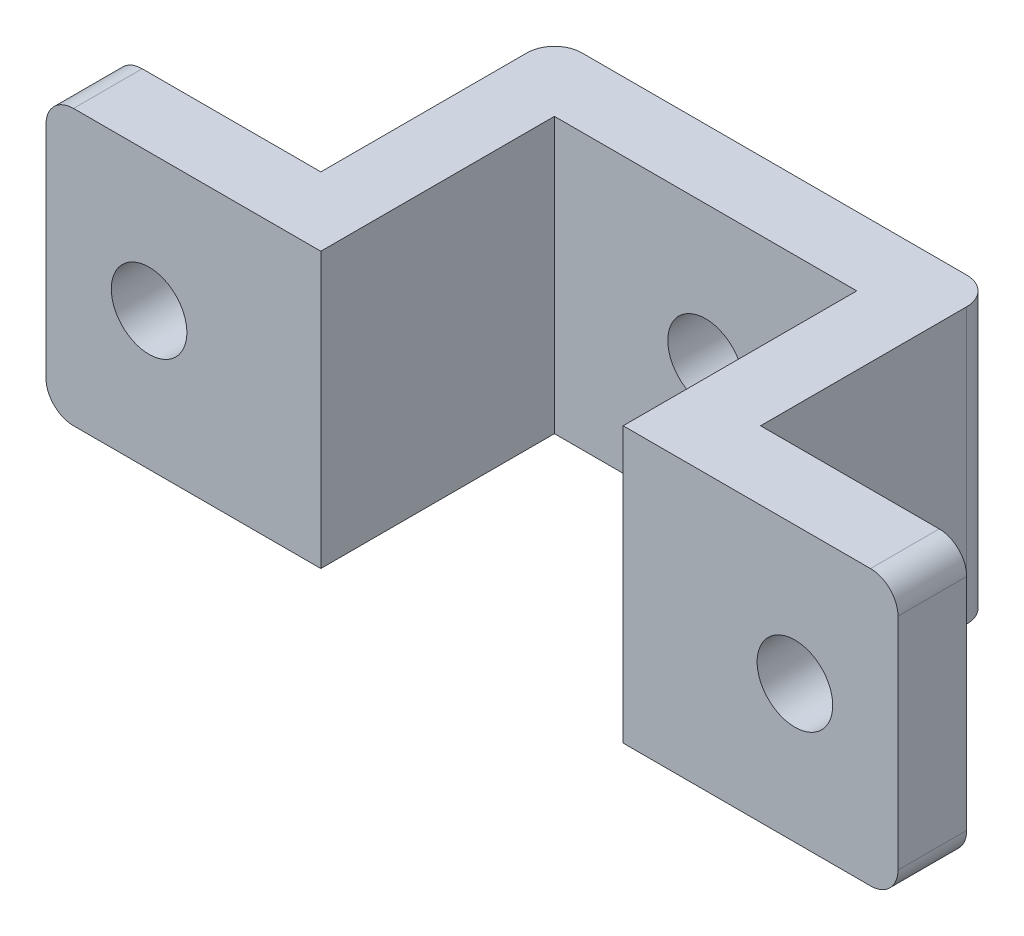
ISO-10303-21;
HEADER;
FILE_DESCRIPTION(('STEP AP214'),'2;1');
FILE_NAME('part.step','',(''),(''),'','','');
FILE_SCHEMA(('AUTOMOTIVE_DESIGN { 1 0 10303 214 1 1 1 1 }'));
ENDSEC;
DATA;
#1=APPLICATION_CONTEXT('core data for automotive mechanical design processes');
#2=APPLICATION_PROTOCOL_DEFINITION('international standard','automotive_design',2000,#1);
#3=PRODUCT_CONTEXT('',#1,'mechanical');
#4=PRODUCT('Part','Part','',(#3));
#5=PRODUCT_RELATED_PRODUCT_CATEGORY('part','',(#4));
#6=PRODUCT_DEFINITION_FORMATION('','',#4);
#7=PRODUCT_DEFINITION_CONTEXT('part definition',#1,'design');
#8=PRODUCT_DEFINITION('design','',#6,#7);
#9=PRODUCT_DEFINITION_SHAPE('','',#8);
#10=(LENGTH_UNIT() NAMED_UNIT(*) SI_UNIT(.MILLI.,.METRE.));
#11=(NAMED_UNIT(*) PLANE_ANGLE_UNIT() SI_UNIT($,.RADIAN.));
#12=(NAMED_UNIT(*) SI_UNIT($,.STERADIAN.) SOLID_ANGLE_UNIT());
#13=UNCERTAINTY_MEASURE_WITH_UNIT(LENGTH_MEASURE(1.E-05),#10,'distance_accuracy_value','');
#14=(GEOMETRIC_REPRESENTATION_CONTEXT(3) GLOBAL_UNCERTAINTY_ASSIGNED_CONTEXT((#13)) GLOBAL_UNIT_ASSIGNED_CONTEXT((#10,
#11,#12)) REPRESENTATION_CONTEXT('',''));
#15=CARTESIAN_POINT('',(0.,0.,0.));
#16=DIRECTION('',(0.,0.,1.));
#17=DIRECTION('',(1.,0.,0.));
#18=AXIS2_PLACEMENT_3D('',#15,#16,#17);
#19=CARTESIAN_POINT('',(-12.0579710144928,20.,-6.22222222222222));
#20=DIRECTION('',(0.,0.,1.));
#21=DIRECTION('',(1.,0.,0.));
#22=AXIS2_PLACEMENT_3D('',#19,#20,#21);
#23=PLANE('',#22);
#24=DIRECTION('',(-1.,0.,0.));
#25=VECTOR('',#24,1.);
#26=CARTESIAN_POINT('',(-12.0579710144928,20.,-6.22222222222222));
#27=LINE('',#26,#25);
#28=CARTESIAN_POINT('',(17.9420289855072,20.,-6.22222222222222));
#29=VERTEX_POINT('',#28);
#30=CARTESIAN_POINT('',(-10.0579710144928,20.,-6.22222222222222));
#31=VERTEX_POINT('',#30);
#32=EDGE_CURVE('E191',#29,#31,#27,.T.);
#33=ORIENTED_EDGE('',*,*,#32,.F.);
#34=DIRECTION('',(0.,-1.,0.));
#35=VECTOR('',#34,1.);
#36=CARTESIAN_POINT('',(17.9420289855072,20.,-6.22222222222222));
#37=LINE('',#36,#35);
#38=CARTESIAN_POINT('',(17.9420289855072,0.,-6.22222222222222));
#39=VERTEX_POINT('',#38);
#40=EDGE_CURVE('E264',#29,#39,#37,.T.);
#41=ORIENTED_EDGE('',*,*,#40,.T.);
#42=DIRECTION('',(-1.,0.,0.));
#43=VECTOR('',#42,1.);
#44=CARTESIAN_POINT('',(-12.0579710144928,0.,-6.22222222222222));
#45=LINE('',#44,#43);
#46=CARTESIAN_POINT('',(-10.0579710144928,0.,-6.22222222222222));
#47=VERTEX_POINT('',#46);
#48=EDGE_CURVE('E219',#39,#47,#45,.T.);
#49=ORIENTED_EDGE('',*,*,#48,.T.);
#50=DIRECTION('',(0.,-1.,0.));
#51=VECTOR('',#50,1.);
#52=CARTESIAN_POINT('',(-10.0579710144928,20.,-6.22222222222222));
#53=LINE('',#52,#51);
#54=EDGE_CURVE('E262',#47,#31,#53,.F.);
#55=ORIENTED_EDGE('',*,*,#54,.T.);
#56=EDGE_LOOP('',(#33,#41,#49,#55));
#57=FACE_BOUND('',#56,.T.);
#58=CARTESIAN_POINT('',(3.94202898551479,9.99999999984602,-6.22222222222222));
#59=DIRECTION('',(0.,0.,1.));
#60=DIRECTION('',(1.,0.,0.));
#61=AXIS2_PLACEMENT_3D('',#58,#59,#60);
#62=CIRCLE('',#61,6.);
#63=CARTESIAN_POINT('',(9.9420289855148,9.99999999984602,-6.22222222222222));
#64=VERTEX_POINT('',#63);
#65=EDGE_CURVE('E11',#64,#64,#62,.F.);
#66=ORIENTED_EDGE('',*,*,#65,.F.);
#67=EDGE_LOOP('',(#66));
#68=FACE_BOUND('',#67,.T.);
#69=ADVANCED_FACE('F35',(#57,#68),#23,.F.);
#70=CARTESIAN_POINT('',(-12.0579710144928,20.,-6.22222222222222));
#71=DIRECTION('',(1.,0.,0.));
#72=DIRECTION('',(0.,0.,-1.));
#73=AXIS2_PLACEMENT_3D('',#70,#71,#72);
#74=PLANE('',#73);
#75=DIRECTION('',(0.,0.,1.));
#76=VECTOR('',#75,1.);
#77=CARTESIAN_POINT('',(-12.0579710144928,20.,-6.22222222222222));
#78=LINE('',#77,#76);
#79=CARTESIAN_POINT('',(-12.0579710144928,20.,-4.22222222222222));
#80=VERTEX_POINT('',#79);
#81=CARTESIAN_POINT('',(-12.0579710144928,20.,10.7777777777778));
#82=VERTEX_POINT('',#81);
#83=EDGE_CURVE('E222',#80,#82,#78,.T.);
#84=ORIENTED_EDGE('',*,*,#83,.F.);
#85=DIRECTION('',(0.,-1.,0.));
#86=VECTOR('',#85,1.);
#87=CARTESIAN_POINT('',(-12.0579710144928,20.,-4.22222222222222));
#88=LINE('',#87,#86);
#89=CARTESIAN_POINT('',(-12.0579710144928,0.,-4.22222222222222));
#90=VERTEX_POINT('',#89);
#91=EDGE_CURVE('E43',#80,#90,#88,.T.);
#92=ORIENTED_EDGE('',*,*,#91,.T.);
#93=DIRECTION('',(0.,0.,1.));
#94=VECTOR('',#93,1.);
#95=CARTESIAN_POINT('',(-12.0579710144928,0.,-6.22222222222222));
#96=LINE('',#95,#94);
#97=CARTESIAN_POINT('',(-12.0579710144928,0.,10.7777777777778));
#98=VERTEX_POINT('',#97);
#99=EDGE_CURVE('E201',#90,#98,#96,.T.);
#100=ORIENTED_EDGE('',*,*,#99,.T.);
#101=DIRECTION('',(0.,-1.,0.));
#102=VECTOR('',#101,1.);
#103=CARTESIAN_POINT('',(-12.0579710144928,0.,10.7777777777778));
#104=LINE('',#103,#102);
#105=EDGE_CURVE('E302',#82,#98,#104,.T.);
#106=ORIENTED_EDGE('',*,*,#105,.F.);
#107=EDGE_LOOP('',(#84,#92,#100,#106));
#108=FACE_BOUND('',#107,.T.);
#109=ADVANCED_FACE('F283',(#108),#74,.F.);
#110=CARTESIAN_POINT('',(-12.0579710144928,20.,15.7777777777778));
#111=DIRECTION('',(0.,0.,-1.));
#112=DIRECTION('',(-1.,0.,0.));
#113=AXIS2_PLACEMENT_3D('',#110,#111,#112);
#114=PLANE('',#113);
#115=CARTESIAN_POINT('',(-19.5579710144928,10.,15.7777777777778));
#116=DIRECTION('',(0.,0.,-1.));
#117=DIRECTION('',(-1.,0.,0.));
#118=AXIS2_PLACEMENT_3D('',#115,#116,#117);
#119=CIRCLE('',#118,2.75);
#120=CARTESIAN_POINT('',(-22.3079710144928,10.,15.7777777777778));
#121=VERTEX_POINT('',#120);
#122=EDGE_CURVE('E341',#121,#121,#119,.T.);
#123=ORIENTED_EDGE('',*,*,#122,.T.);
#124=EDGE_LOOP('',(#123));
#125=FACE_BOUND('',#124,.T.);
#126=DIRECTION('',(0.,1.,0.));
#127=VECTOR('',#126,1.);
#128=CARTESIAN_POINT('',(-27.0579710144928,20.,15.7777777777778));
#129=LINE('',#128,#127);
#130=CARTESIAN_POINT('',(-27.0579710144928,2.,15.7777777777778));
#131=VERTEX_POINT('',#130);
#132=CARTESIAN_POINT('',(-27.0579710144928,18.,15.7777777777778));
#133=VERTEX_POINT('',#132);
#134=EDGE_CURVE('E299',#131,#133,#129,.T.);
#135=ORIENTED_EDGE('',*,*,#134,.F.);
#136=CARTESIAN_POINT('',(-25.0579710144927,2.,15.7777777777778));
#137=DIRECTION('',(0.,0.,-1.));
#138=DIRECTION('',(-1.,0.,0.));
#139=AXIS2_PLACEMENT_3D('',#136,#137,#138);
#140=CIRCLE('',#139,2.);
#141=CARTESIAN_POINT('',(-25.0579710144928,0.,15.7777777777778));
#142=VERTEX_POINT('',#141);
#143=EDGE_CURVE('E275',#131,#142,#140,.F.);
#144=ORIENTED_EDGE('',*,*,#143,.T.);
#145=DIRECTION('',(1.,0.,0.));
#146=VECTOR('',#145,1.);
#147=CARTESIAN_POINT('',(-12.0579710144928,0.,15.7777777777778));
#148=LINE('',#147,#146);
#149=CARTESIAN_POINT('',(-7.05797101449275,0.,15.7777777777778));
#150=VERTEX_POINT('',#149);
#151=EDGE_CURVE('E204',#142,#150,#148,.T.);
#152=ORIENTED_EDGE('',*,*,#151,.T.);
#153=DIRECTION('',(0.,-1.,0.));
#154=VECTOR('',#153,1.);
#155=CARTESIAN_POINT('',(-7.05797101449275,20.,15.7777777777778));
#156=LINE('',#155,#154);
#157=CARTESIAN_POINT('',(-7.05797101449275,20.,15.7777777777778));
#158=VERTEX_POINT('',#157);
#159=EDGE_CURVE('E231',#158,#150,#156,.T.);
#160=ORIENTED_EDGE('',*,*,#159,.F.);
#161=DIRECTION('',(1.,0.,0.));
#162=VECTOR('',#161,1.);
#163=CARTESIAN_POINT('',(-12.0579710144928,20.,15.7777777777778));
#164=LINE('',#163,#162);
#165=CARTESIAN_POINT('',(-25.0579710144927,20.,15.7777777777778));
#166=VERTEX_POINT('',#165);
#167=EDGE_CURVE('E307',#166,#158,#164,.T.);
#168=ORIENTED_EDGE('',*,*,#167,.F.);
#169=CARTESIAN_POINT('',(-25.0579710144927,18.,15.7777777777778));
#170=DIRECTION('',(0.,0.,-1.));
#171=DIRECTION('',(-1.,0.,0.));
#172=AXIS2_PLACEMENT_3D('',#169,#170,#171);
#173=CIRCLE('',#172,2.);
#174=EDGE_CURVE('E273',#166,#133,#173,.F.);
#175=ORIENTED_EDGE('',*,*,#174,.T.);
#176=EDGE_LOOP('',(#135,#144,#152,#160,#168,#175));
#177=FACE_BOUND('',#176,.T.);
#178=ADVANCED_FACE('F375',(#125,#177),#114,.F.);
#179=CARTESIAN_POINT('',(-7.05797101449275,20.,-1.22222222222222));
#180=DIRECTION('',(-1.,0.,0.));
#181=DIRECTION('',(0.,0.,1.));
#182=AXIS2_PLACEMENT_3D('',#179,#180,#181);
#183=PLANE('',#182);
#184=DIRECTION('',(0.,0.,-1.));
#185=VECTOR('',#184,1.);
#186=CARTESIAN_POINT('',(-7.05797101449275,0.,-1.22222222222222));
#187=LINE('',#186,#185);
#188=CARTESIAN_POINT('',(-7.05797101449275,0.,-1.22222222222222));
#189=VERTEX_POINT('',#188);
#190=EDGE_CURVE('E207',#150,#189,#187,.T.);
#191=ORIENTED_EDGE('',*,*,#190,.T.);
#192=DIRECTION('',(0.,-1.,0.));
#193=VECTOR('',#192,1.);
#194=CARTESIAN_POINT('',(-7.05797101449275,20.,-1.22222222222222));
#195=LINE('',#194,#193);
#196=CARTESIAN_POINT('',(-7.05797101449275,20.,-1.22222222222222));
#197=VERTEX_POINT('',#196);
#198=EDGE_CURVE('E228',#197,#189,#195,.T.);
#199=ORIENTED_EDGE('',*,*,#198,.F.);
#200=DIRECTION('',(0.,0.,-1.));
#201=VECTOR('',#200,1.);
#202=CARTESIAN_POINT('',(-7.05797101449275,20.,10.7777777777778));
#203=LINE('',#202,#201);
#204=EDGE_CURVE('E309',#158,#197,#203,.T.);
#205=ORIENTED_EDGE('',*,*,#204,.F.);
#206=ORIENTED_EDGE('',*,*,#159,.T.);
#207=EDGE_LOOP('',(#191,#199,#205,#206));
#208=FACE_BOUND('',#207,.T.);
#209=ADVANCED_FACE('F390',(#208),#183,.F.);
#210=CARTESIAN_POINT('',(-7.05797101449275,20.,-1.22222222222222));
#211=DIRECTION('',(0.,0.,-1.));
#212=DIRECTION('',(-1.,0.,0.));
#213=AXIS2_PLACEMENT_3D('',#210,#211,#212);
#214=PLANE('',#213);
#215=CARTESIAN_POINT('',(3.94202898550725,10.,-1.22222222222222));
#216=DIRECTION('',(0.,0.,-1.));
#217=DIRECTION('',(-1.,0.,0.));
#218=AXIS2_PLACEMENT_3D('',#215,#216,#217);
#219=CIRCLE('',#218,2.75);
#220=CARTESIAN_POINT('',(1.19202898550725,10.,-1.22222222222222));
#221=VERTEX_POINT('',#220);
#222=EDGE_CURVE('E205',#221,#221,#219,.T.);
#223=ORIENTED_EDGE('',*,*,#222,.T.);
#224=EDGE_LOOP('',(#223));
#225=FACE_BOUND('',#224,.T.);
#226=DIRECTION('',(1.,0.,0.));
#227=VECTOR('',#226,1.);
#228=CARTESIAN_POINT('',(-7.05797101449275,0.,-1.22222222222222));
#229=LINE('',#228,#227);
#230=CARTESIAN_POINT('',(14.9420289855072,0.,-1.22222222222222));
#231=VERTEX_POINT('',#230);
#232=EDGE_CURVE('E209',#189,#231,#229,.T.);
#233=ORIENTED_EDGE('',*,*,#232,.T.);
#234=DIRECTION('',(0.,-1.,0.));
#235=VECTOR('',#234,1.);
#236=CARTESIAN_POINT('',(14.9420289855072,20.,-1.22222222222222));
#237=LINE('',#236,#235);
#238=CARTESIAN_POINT('',(14.9420289855072,20.,-1.22222222222222));
#239=VERTEX_POINT('',#238);
#240=EDGE_CURVE('E225',#239,#231,#237,.T.);
#241=ORIENTED_EDGE('',*,*,#240,.F.);
#242=DIRECTION('',(1.,0.,0.));
#243=VECTOR('',#242,1.);
#244=CARTESIAN_POINT('',(-7.05797101449275,20.,-1.22222222222222));
#245=LINE('',#244,#243);
#246=EDGE_CURVE('E311',#197,#239,#245,.T.);
#247=ORIENTED_EDGE('',*,*,#246,.F.);
#248=ORIENTED_EDGE('',*,*,#198,.T.);
#249=EDGE_LOOP('',(#233,#241,#247,#248));
#250=FACE_BOUND('',#249,.T.);
#251=ADVANCED_FACE('F387',(#225,#250),#214,.F.);
#252=CARTESIAN_POINT('',(14.9420289855072,20.,10.7777777777778));
#253=DIRECTION('',(1.,0.,0.));
#254=DIRECTION('',(0.,0.,-1.));
#255=AXIS2_PLACEMENT_3D('',#252,#253,#254);
#256=PLANE('',#255);
#257=DIRECTION('',(0.,0.,1.));
#258=VECTOR('',#257,1.);
#259=CARTESIAN_POINT('',(14.9420289855072,0.,10.7777777777778));
#260=LINE('',#259,#258);
#261=CARTESIAN_POINT('',(14.9420289855072,0.,15.7777777777778));
#262=VERTEX_POINT('',#261);
#263=EDGE_CURVE('E212',#231,#262,#260,.T.);
#264=ORIENTED_EDGE('',*,*,#263,.T.);
#265=DIRECTION('',(0.,-1.,0.));
#266=VECTOR('',#265,1.);
#267=CARTESIAN_POINT('',(14.9420289855072,20.,15.7777777777778));
#268=LINE('',#267,#266);
#269=CARTESIAN_POINT('',(14.9420289855072,20.,15.7777777777778));
#270=VERTEX_POINT('',#269);
#271=EDGE_CURVE('E195',#270,#262,#268,.T.);
#272=ORIENTED_EDGE('',*,*,#271,.F.);
#273=DIRECTION('',(0.,0.,1.));
#274=VECTOR('',#273,1.);
#275=CARTESIAN_POINT('',(14.9420289855072,20.,-1.22222222222222));
#276=LINE('',#275,#274);
#277=EDGE_CURVE('E197',#239,#270,#276,.T.);
#278=ORIENTED_EDGE('',*,*,#277,.F.);
#279=ORIENTED_EDGE('',*,*,#240,.T.);
#280=EDGE_LOOP('',(#264,#272,#278,#279));
#281=FACE_BOUND('',#280,.T.);
#282=ADVANCED_FACE('F318',(#281),#256,.F.);
#283=CARTESIAN_POINT('',(14.9420289855072,20.,15.7777777777778));
#284=DIRECTION('',(0.,0.,-1.));
#285=DIRECTION('',(-1.,0.,0.));
#286=AXIS2_PLACEMENT_3D('',#283,#284,#285);
#287=PLANE('',#286);
#288=CARTESIAN_POINT('',(27.4420289855073,10.,15.7777777777778));
#289=DIRECTION('',(0.,0.,1.));
#290=DIRECTION('',(1.,0.,0.));
#291=AXIS2_PLACEMENT_3D('',#288,#289,#290);
#292=CIRCLE('',#291,2.75);
#293=CARTESIAN_POINT('',(30.1920289855072,10.,15.7777777777778));
#294=VERTEX_POINT('',#293);
#295=EDGE_CURVE('E186',#294,#294,#292,.T.);
#296=ORIENTED_EDGE('',*,*,#295,.F.);
#297=EDGE_LOOP('',(#296));
#298=FACE_BOUND('',#297,.T.);
#299=DIRECTION('',(1.,0.,0.));
#300=VECTOR('',#299,1.);
#301=CARTESIAN_POINT('',(14.9420289855072,0.,15.7777777777778));
#302=LINE('',#301,#300);
#303=CARTESIAN_POINT('',(32.9420289855072,0.,15.7777777777778));
#304=VERTEX_POINT('',#303);
#305=EDGE_CURVE('E214',#262,#304,#302,.T.);
#306=ORIENTED_EDGE('',*,*,#305,.T.);
#307=CARTESIAN_POINT('',(32.9420289855072,2.,15.7777777777778));
#308=DIRECTION('',(0.,0.,-1.));
#309=DIRECTION('',(-1.,0.,0.));
#310=AXIS2_PLACEMENT_3D('',#307,#308,#309);
#311=CIRCLE('',#310,2.);
#312=CARTESIAN_POINT('',(34.9420289855072,2.,15.7777777777778));
#313=VERTEX_POINT('',#312);
#314=EDGE_CURVE('E245',#304,#313,#311,.F.);
#315=ORIENTED_EDGE('',*,*,#314,.T.);
#316=DIRECTION('',(0.,1.,0.));
#317=VECTOR('',#316,1.);
#318=CARTESIAN_POINT('',(34.9420289855072,20.,15.7777777777778));
#319=LINE('',#318,#317);
#320=CARTESIAN_POINT('',(34.9420289855072,18.,15.7777777777778));
#321=VERTEX_POINT('',#320);
#322=EDGE_CURVE('E175',#313,#321,#319,.T.);
#323=ORIENTED_EDGE('',*,*,#322,.T.);
#324=CARTESIAN_POINT('',(32.9420289855072,18.,15.7777777777778));
#325=DIRECTION('',(0.,0.,-1.));
#326=DIRECTION('',(-1.,0.,0.));
#327=AXIS2_PLACEMENT_3D('',#324,#325,#326);
#328=CIRCLE('',#327,2.);
#329=CARTESIAN_POINT('',(32.9420289855072,20.,15.7777777777778));
#330=VERTEX_POINT('',#329);
#331=EDGE_CURVE('E243',#321,#330,#328,.F.);
#332=ORIENTED_EDGE('',*,*,#331,.T.);
#333=DIRECTION('',(1.,0.,0.));
#334=VECTOR('',#333,1.);
#335=CARTESIAN_POINT('',(14.9420289855072,20.,15.7777777777778));
#336=LINE('',#335,#334);
#337=EDGE_CURVE('E192',#270,#330,#336,.T.);
#338=ORIENTED_EDGE('',*,*,#337,.F.);
#339=ORIENTED_EDGE('',*,*,#271,.T.);
#340=EDGE_LOOP('',(#306,#315,#323,#332,#338,#339));
#341=FACE_BOUND('',#340,.T.);
#342=ADVANCED_FACE('F321',(#298,#341),#287,.F.);
#343=CARTESIAN_POINT('',(19.9420289855072,20.,-6.22222222222222));
#344=DIRECTION('',(-1.,0.,0.));
#345=DIRECTION('',(0.,0.,1.));
#346=AXIS2_PLACEMENT_3D('',#343,#344,#345);
#347=PLANE('',#346);
#348=DIRECTION('',(0.,0.,-1.));
#349=VECTOR('',#348,1.);
#350=CARTESIAN_POINT('',(19.9420289855072,0.,-6.22222222222222));
#351=LINE('',#350,#349);
#352=CARTESIAN_POINT('',(19.9420289855072,0.,10.7777777777778));
#353=VERTEX_POINT('',#352);
#354=CARTESIAN_POINT('',(19.9420289855072,0.,-4.22222222222222));
#355=VERTEX_POINT('',#354);
#356=EDGE_CURVE('E217',#353,#355,#351,.T.);
#357=ORIENTED_EDGE('',*,*,#356,.T.);
#358=DIRECTION('',(0.,-1.,0.));
#359=VECTOR('',#358,1.);
#360=CARTESIAN_POINT('',(19.9420289855072,20.,-4.22222222222222));
#361=LINE('',#360,#359);
#362=CARTESIAN_POINT('',(19.9420289855072,20.,-4.22222222222222));
#363=VERTEX_POINT('',#362);
#364=EDGE_CURVE('E190',#355,#363,#361,.F.);
#365=ORIENTED_EDGE('',*,*,#364,.T.);
#366=DIRECTION('',(0.,0.,-1.));
#367=VECTOR('',#366,1.);
#368=CARTESIAN_POINT('',(19.9420289855072,20.,-6.22222222222222));
#369=LINE('',#368,#367);
#370=CARTESIAN_POINT('',(19.9420289855072,20.,10.7777777777778));
#371=VERTEX_POINT('',#370);
#372=EDGE_CURVE('E169',#371,#363,#369,.T.);
#373=ORIENTED_EDGE('',*,*,#372,.F.);
#374=DIRECTION('',(0.,-1.,0.));
#375=VECTOR('',#374,1.);
#376=CARTESIAN_POINT('',(19.9420289855072,0.,10.7777777777778));
#377=LINE('',#376,#375);
#378=EDGE_CURVE('E178',#371,#353,#377,.T.);
#379=ORIENTED_EDGE('',*,*,#378,.T.);
#380=EDGE_LOOP('',(#357,#365,#373,#379));
#381=FACE_BOUND('',#380,.T.);
#382=ADVANCED_FACE('F188',(#381),#347,.F.);
#383=CARTESIAN_POINT('',(0.,20.,0.));
#384=DIRECTION('',(0.,1.,0.));
#385=DIRECTION('',(0.,0.,1.));
#386=AXIS2_PLACEMENT_3D('',#383,#384,#385);
#387=PLANE('',#386);
#388=ORIENTED_EDGE('',*,*,#337,.T.);
#389=DIRECTION('',(0.,0.,-1.));
#390=VECTOR('',#389,1.);
#391=CARTESIAN_POINT('',(32.9420289855072,20.,10.7777777777778));
#392=LINE('',#391,#390);
#393=CARTESIAN_POINT('',(32.9420289855072,20.,10.7777777777778));
#394=VERTEX_POINT('',#393);
#395=EDGE_CURVE('E172',#330,#394,#392,.T.);
#396=ORIENTED_EDGE('',*,*,#395,.T.);
#397=DIRECTION('',(-1.,0.,0.));
#398=VECTOR('',#397,1.);
#399=CARTESIAN_POINT('',(34.9420289855072,20.,10.7777777777778));
#400=LINE('',#399,#398);
#401=EDGE_CURVE('E164',#394,#371,#400,.T.);
#402=ORIENTED_EDGE('',*,*,#401,.T.);
#403=ORIENTED_EDGE('',*,*,#372,.T.);
#404=CARTESIAN_POINT('',(17.9420289855072,20.,-4.22222222222222));
#405=DIRECTION('',(0.,1.,0.));
#406=DIRECTION('',(0.,0.,1.));
#407=AXIS2_PLACEMENT_3D('',#404,#405,#406);
#408=CIRCLE('',#407,2.);
#409=EDGE_CURVE('E259',#363,#29,#408,.T.);
#410=ORIENTED_EDGE('',*,*,#409,.T.);
#411=ORIENTED_EDGE('',*,*,#32,.T.);
#412=CARTESIAN_POINT('',(-10.0579710144928,20.,-4.22222222222222));
#413=DIRECTION('',(0.,1.,0.));
#414=DIRECTION('',(0.,0.,1.));
#415=AXIS2_PLACEMENT_3D('',#412,#413,#414);
#416=CIRCLE('',#415,2.);
#417=EDGE_CURVE('E255',#31,#80,#416,.T.);
#418=ORIENTED_EDGE('',*,*,#417,.T.);
#419=ORIENTED_EDGE('',*,*,#83,.T.);
#420=DIRECTION('',(1.,0.,0.));
#421=VECTOR('',#420,1.);
#422=CARTESIAN_POINT('',(-27.0579710144928,20.,10.7777777777778));
#423=LINE('',#422,#421);
#424=CARTESIAN_POINT('',(-25.0579710144927,20.,10.7777777777778));
#425=VERTEX_POINT('',#424);
#426=EDGE_CURVE('E295',#425,#82,#423,.T.);
#427=ORIENTED_EDGE('',*,*,#426,.F.);
#428=DIRECTION('',(0.,0.,-1.));
#429=VECTOR('',#428,1.);
#430=CARTESIAN_POINT('',(-25.0579710144927,20.,15.7777777777778));
#431=LINE('',#430,#429);
#432=EDGE_CURVE('E257',#425,#166,#431,.F.);
#433=ORIENTED_EDGE('',*,*,#432,.T.);
#434=ORIENTED_EDGE('',*,*,#167,.T.);
#435=ORIENTED_EDGE('',*,*,#204,.T.);
#436=ORIENTED_EDGE('',*,*,#246,.T.);
#437=ORIENTED_EDGE('',*,*,#277,.T.);
#438=EDGE_LOOP('',(#388,#396,#402,#403,#410,#411,#418,#419,#427,#433,#434,#435,#436,#437));
#439=FACE_BOUND('',#438,.T.);
#440=ADVANCED_FACE('F167',(#439),#387,.T.);
#441=CARTESIAN_POINT('',(0.,0.,0.));
#442=DIRECTION('',(0.,1.,0.));
#443=DIRECTION('',(0.,0.,1.));
#444=AXIS2_PLACEMENT_3D('',#441,#442,#443);
#445=PLANE('',#444);
#446=DIRECTION('',(-1.,0.,0.));
#447=VECTOR('',#446,1.);
#448=CARTESIAN_POINT('',(34.9420289855072,0.,10.7777777777778));
#449=LINE('',#448,#447);
#450=CARTESIAN_POINT('',(32.9420289855072,0.,10.7777777777778));
#451=VERTEX_POINT('',#450);
#452=EDGE_CURVE('E174',#451,#353,#449,.T.);
#453=ORIENTED_EDGE('',*,*,#452,.F.);
#454=DIRECTION('',(0.,0.,1.));
#455=VECTOR('',#454,1.);
#456=CARTESIAN_POINT('',(32.9420289855072,0.,0.));
#457=LINE('',#456,#455);
#458=EDGE_CURVE('E240',#451,#304,#457,.T.);
#459=ORIENTED_EDGE('',*,*,#458,.T.);
#460=ORIENTED_EDGE('',*,*,#305,.F.);
#461=ORIENTED_EDGE('',*,*,#263,.F.);
#462=ORIENTED_EDGE('',*,*,#232,.F.);
#463=ORIENTED_EDGE('',*,*,#190,.F.);
#464=ORIENTED_EDGE('',*,*,#151,.F.);
#465=DIRECTION('',(0.,0.,1.));
#466=VECTOR('',#465,1.);
#467=CARTESIAN_POINT('',(-25.0579710144928,0.,0.));
#468=LINE('',#467,#466);
#469=CARTESIAN_POINT('',(-25.0579710144928,0.,10.7777777777778));
#470=VERTEX_POINT('',#469);
#471=EDGE_CURVE('E236',#142,#470,#468,.F.);
#472=ORIENTED_EDGE('',*,*,#471,.T.);
#473=DIRECTION('',(1.,0.,0.));
#474=VECTOR('',#473,1.);
#475=CARTESIAN_POINT('',(-27.0579710144928,0.,10.7777777777778));
#476=LINE('',#475,#474);
#477=EDGE_CURVE('E292',#470,#98,#476,.T.);
#478=ORIENTED_EDGE('',*,*,#477,.T.);
#479=ORIENTED_EDGE('',*,*,#99,.F.);
#480=CARTESIAN_POINT('',(-10.0579710144928,0.,-4.22222222222222));
#481=DIRECTION('',(0.,1.,0.));
#482=DIRECTION('',(0.,0.,1.));
#483=AXIS2_PLACEMENT_3D('',#480,#481,#482);
#484=CIRCLE('',#483,2.);
#485=EDGE_CURVE('E234',#90,#47,#484,.F.);
#486=ORIENTED_EDGE('',*,*,#485,.T.);
#487=ORIENTED_EDGE('',*,*,#48,.F.);
#488=CARTESIAN_POINT('',(17.9420289855072,0.,-4.22222222222222));
#489=DIRECTION('',(0.,1.,0.));
#490=DIRECTION('',(0.,0.,1.));
#491=AXIS2_PLACEMENT_3D('',#488,#489,#490);
#492=CIRCLE('',#491,2.);
#493=EDGE_CURVE('E238',#39,#355,#492,.F.);
#494=ORIENTED_EDGE('',*,*,#493,.T.);
#495=ORIENTED_EDGE('',*,*,#356,.F.);
#496=EDGE_LOOP('',(#453,#459,#460,#461,#462,#463,#464,#472,#478,#479,#486,#487,#494,#495));
#497=FACE_BOUND('',#496,.T.);
#498=ADVANCED_FACE('F290',(#497),#445,.F.);
#499=CARTESIAN_POINT('',(3.94202898550725,10.,15.7777777777778));
#500=DIRECTION('',(0.,0.,-1.));
#501=DIRECTION('',(-1.,0.,0.));
#502=AXIS2_PLACEMENT_3D('',#499,#500,#501);
#503=CYLINDRICAL_SURFACE('',#502,2.75);
#504=ORIENTED_EDGE('',*,*,#222,.F.);
#505=EDGE_LOOP('',(#504));
#506=FACE_BOUND('',#505,.T.);
#507=CARTESIAN_POINT('',(3.94202898551479,9.99999999984602,-9.22222222222222));
#508=DIRECTION('',(0.,0.,-1.));
#509=DIRECTION('',(-1.,0.,0.));
#510=AXIS2_PLACEMENT_3D('',#507,#508,#509);
#511=CIRCLE('',#510,2.75000000003133);
#512=CARTESIAN_POINT('',(1.19202898548346,9.99999999984602,-9.22222222222222));
#513=VERTEX_POINT('',#512);
#514=EDGE_CURVE('E625',#513,#513,#511,.T.);
#515=ORIENTED_EDGE('',*,*,#514,.T.);
#516=EDGE_LOOP('',(#515));
#517=FACE_BOUND('',#516,.T.);
#518=ADVANCED_FACE('F450',(#506,#517),#503,.F.);
#519=CARTESIAN_POINT('',(-27.0579710144928,0.,10.7777777777778));
#520=DIRECTION('',(0.,0.,1.));
#521=DIRECTION('',(1.,0.,0.));
#522=AXIS2_PLACEMENT_3D('',#519,#520,#521);
#523=PLANE('',#522);
#524=CARTESIAN_POINT('',(-19.5579710144928,10.,10.7777777777778));
#525=DIRECTION('',(0.,0.,-1.));
#526=DIRECTION('',(-1.,0.,0.));
#527=AXIS2_PLACEMENT_3D('',#524,#525,#526);
#528=CIRCLE('',#527,2.75);
#529=CARTESIAN_POINT('',(-22.3079710144928,10.,10.7777777777778));
#530=VERTEX_POINT('',#529);
#531=EDGE_CURVE('E340',#530,#530,#528,.T.);
#532=ORIENTED_EDGE('',*,*,#531,.F.);
#533=EDGE_LOOP('',(#532));
#534=FACE_BOUND('',#533,.T.);
#535=ORIENTED_EDGE('',*,*,#477,.F.);
#536=CARTESIAN_POINT('',(-25.0579710144928,2.,10.7777777777778));
#537=DIRECTION('',(0.,0.,1.));
#538=DIRECTION('',(1.,0.,0.));
#539=AXIS2_PLACEMENT_3D('',#536,#537,#538);
#540=CIRCLE('',#539,2.);
#541=CARTESIAN_POINT('',(-27.0579710144928,2.,10.7777777777778));
#542=VERTEX_POINT('',#541);
#543=EDGE_CURVE('E50',#470,#542,#540,.F.);
#544=ORIENTED_EDGE('',*,*,#543,.T.);
#545=DIRECTION('',(0.,-1.,0.));
#546=VECTOR('',#545,1.);
#547=CARTESIAN_POINT('',(-27.0579710144928,0.,10.7777777777778));
#548=LINE('',#547,#546);
#549=CARTESIAN_POINT('',(-27.0579710144928,18.,10.7777777777778));
#550=VERTEX_POINT('',#549);
#551=EDGE_CURVE('E296',#550,#542,#548,.T.);
#552=ORIENTED_EDGE('',*,*,#551,.F.);
#553=CARTESIAN_POINT('',(-25.0579710144928,18.,10.7777777777778));
#554=DIRECTION('',(0.,0.,1.));
#555=DIRECTION('',(1.,0.,0.));
#556=AXIS2_PLACEMENT_3D('',#553,#554,#555);
#557=CIRCLE('',#556,2.);
#558=EDGE_CURVE('E58',#550,#425,#557,.F.);
#559=ORIENTED_EDGE('',*,*,#558,.T.);
#560=ORIENTED_EDGE('',*,*,#426,.T.);
#561=ORIENTED_EDGE('',*,*,#105,.T.);
#562=EDGE_LOOP('',(#535,#544,#552,#559,#560,#561));
#563=FACE_BOUND('',#562,.T.);
#564=ADVANCED_FACE('F349',(#534,#563),#523,.F.);
#565=CARTESIAN_POINT('',(-27.0579710144928,0.,0.));
#566=DIRECTION('',(1.,0.,0.));
#567=DIRECTION('',(0.,0.,-1.));
#568=AXIS2_PLACEMENT_3D('',#565,#566,#567);
#569=PLANE('',#568);
#570=ORIENTED_EDGE('',*,*,#551,.T.);
#571=DIRECTION('',(0.,0.,1.));
#572=VECTOR('',#571,1.);
#573=CARTESIAN_POINT('',(-27.0579710144928,2.,0.));
#574=LINE('',#573,#572);
#575=EDGE_CURVE('E270',#542,#131,#574,.T.);
#576=ORIENTED_EDGE('',*,*,#575,.T.);
#577=ORIENTED_EDGE('',*,*,#134,.T.);
#578=DIRECTION('',(0.,0.,-1.));
#579=VECTOR('',#578,1.);
#580=CARTESIAN_POINT('',(-27.0579710144928,18.,10.7777777777778));
#581=LINE('',#580,#579);
#582=EDGE_CURVE('E268',#133,#550,#581,.T.);
#583=ORIENTED_EDGE('',*,*,#582,.T.);
#584=EDGE_LOOP('',(#570,#576,#577,#583));
#585=FACE_BOUND('',#584,.T.);
#586=ADVANCED_FACE('F415',(#585),#569,.F.);
#587=CARTESIAN_POINT('',(-19.5579710144928,10.,15.7777777777778));
#588=DIRECTION('',(0.,0.,-1.));
#589=DIRECTION('',(-1.,0.,0.));
#590=AXIS2_PLACEMENT_3D('',#587,#588,#589);
#591=CYLINDRICAL_SURFACE('',#590,2.75);
#592=ORIENTED_EDGE('',*,*,#122,.F.);
#593=EDGE_LOOP('',(#592));
#594=FACE_BOUND('',#593,.T.);
#595=ORIENTED_EDGE('',*,*,#531,.T.);
#596=EDGE_LOOP('',(#595));
#597=FACE_BOUND('',#596,.T.);
#598=ADVANCED_FACE('F441',(#594,#597),#591,.F.);
#599=CARTESIAN_POINT('',(34.9420289855072,0.,10.7777777777778));
#600=DIRECTION('',(0.,0.,-1.));
#601=DIRECTION('',(-1.,0.,0.));
#602=AXIS2_PLACEMENT_3D('',#599,#600,#601);
#603=PLANE('',#602);
#604=CARTESIAN_POINT('',(27.4420289855073,10.,10.7777777777778));
#605=DIRECTION('',(0.,0.,1.));
#606=DIRECTION('',(1.,0.,0.));
#607=AXIS2_PLACEMENT_3D('',#604,#605,#606);
#608=CIRCLE('',#607,2.75);
#609=CARTESIAN_POINT('',(30.1920289855072,10.,10.7777777777778));
#610=VERTEX_POINT('',#609);
#611=EDGE_CURVE('E336',#610,#610,#608,.T.);
#612=ORIENTED_EDGE('',*,*,#611,.T.);
#613=EDGE_LOOP('',(#612));
#614=FACE_BOUND('',#613,.T.);
#615=DIRECTION('',(0.,-1.,0.));
#616=VECTOR('',#615,1.);
#617=CARTESIAN_POINT('',(34.9420289855072,0.,10.7777777777778));
#618=LINE('',#617,#616);
#619=CARTESIAN_POINT('',(34.9420289855072,18.,10.7777777777778));
#620=VERTEX_POINT('',#619);
#621=CARTESIAN_POINT('',(34.9420289855072,2.,10.7777777777778));
#622=VERTEX_POINT('',#621);
#623=EDGE_CURVE('E185',#620,#622,#618,.T.);
#624=ORIENTED_EDGE('',*,*,#623,.T.);
#625=CARTESIAN_POINT('',(32.9420289855072,2.,10.7777777777778));
#626=DIRECTION('',(0.,0.,-1.));
#627=DIRECTION('',(-1.,0.,0.));
#628=AXIS2_PLACEMENT_3D('',#625,#626,#627);
#629=CIRCLE('',#628,2.);
#630=EDGE_CURVE('E253',#622,#451,#629,.T.);
#631=ORIENTED_EDGE('',*,*,#630,.T.);
#632=ORIENTED_EDGE('',*,*,#452,.T.);
#633=ORIENTED_EDGE('',*,*,#378,.F.);
#634=ORIENTED_EDGE('',*,*,#401,.F.);
#635=CARTESIAN_POINT('',(32.9420289855072,18.,10.7777777777778));
#636=DIRECTION('',(0.,0.,-1.));
#637=DIRECTION('',(-1.,0.,0.));
#638=AXIS2_PLACEMENT_3D('',#635,#636,#637);
#639=CIRCLE('',#638,2.);
#640=EDGE_CURVE('E251',#394,#620,#639,.T.);
#641=ORIENTED_EDGE('',*,*,#640,.T.);
#642=EDGE_LOOP('',(#624,#631,#632,#633,#634,#641));
#643=FACE_BOUND('',#642,.T.);
#644=ADVANCED_FACE('F180',(#614,#643),#603,.T.);
#645=CARTESIAN_POINT('',(34.9420289855072,0.,0.));
#646=DIRECTION('',(-1.,0.,0.));
#647=DIRECTION('',(0.,0.,-1.));
#648=AXIS2_PLACEMENT_3D('',#645,#646,#647);
#649=PLANE('',#648);
#650=ORIENTED_EDGE('',*,*,#322,.F.);
#651=DIRECTION('',(0.,0.,1.));
#652=VECTOR('',#651,1.);
#653=CARTESIAN_POINT('',(34.9420289855072,2.,0.));
#654=LINE('',#653,#652);
#655=EDGE_CURVE('E249',#313,#622,#654,.F.);
#656=ORIENTED_EDGE('',*,*,#655,.T.);
#657=ORIENTED_EDGE('',*,*,#623,.F.);
#658=DIRECTION('',(0.,0.,-1.));
#659=VECTOR('',#658,1.);
#660=CARTESIAN_POINT('',(34.9420289855072,18.,15.7777777777778));
#661=LINE('',#660,#659);
#662=EDGE_CURVE('E247',#620,#321,#661,.F.);
#663=ORIENTED_EDGE('',*,*,#662,.T.);
#664=EDGE_LOOP('',(#650,#656,#657,#663));
#665=FACE_BOUND('',#664,.T.);
#666=ADVANCED_FACE('F331',(#665),#649,.F.);
#667=CARTESIAN_POINT('',(27.4420289855073,10.,15.7777777777778));
#668=DIRECTION('',(0.,0.,-1.));
#669=DIRECTION('',(-1.,0.,0.));
#670=AXIS2_PLACEMENT_3D('',#667,#668,#669);
#671=CYLINDRICAL_SURFACE('',#670,2.75);
#672=ORIENTED_EDGE('',*,*,#295,.T.);
#673=EDGE_LOOP('',(#672));
#674=FACE_BOUND('',#673,.T.);
#675=ORIENTED_EDGE('',*,*,#611,.F.);
#676=EDGE_LOOP('',(#675));
#677=FACE_BOUND('',#676,.T.);
#678=ADVANCED_FACE('F399',(#674,#677),#671,.F.);
#679=CARTESIAN_POINT('',(32.9420289855072,2.,0.));
#680=DIRECTION('',(0.,0.,1.));
#681=DIRECTION('',(1.,0.,0.));
#682=AXIS2_PLACEMENT_3D('',#679,#680,#681);
#683=CYLINDRICAL_SURFACE('',#682,2.);
#684=ORIENTED_EDGE('',*,*,#630,.F.);
#685=ORIENTED_EDGE('',*,*,#655,.F.);
#686=ORIENTED_EDGE('',*,*,#314,.F.);
#687=ORIENTED_EDGE('',*,*,#458,.F.);
#688=EDGE_LOOP('',(#684,#685,#686,#687));
#689=FACE_BOUND('',#688,.T.);
#690=ADVANCED_FACE('F368',(#689),#683,.T.);
#691=CARTESIAN_POINT('',(32.9420289855072,18.,0.));
#692=DIRECTION('',(0.,0.,1.));
#693=DIRECTION('',(1.,0.,0.));
#694=AXIS2_PLACEMENT_3D('',#691,#692,#693);
#695=CYLINDRICAL_SURFACE('',#694,2.);
#696=ORIENTED_EDGE('',*,*,#331,.F.);
#697=ORIENTED_EDGE('',*,*,#662,.F.);
#698=ORIENTED_EDGE('',*,*,#640,.F.);
#699=ORIENTED_EDGE('',*,*,#395,.F.);
#700=EDGE_LOOP('',(#696,#697,#698,#699));
#701=FACE_BOUND('',#700,.T.);
#702=ADVANCED_FACE('F327',(#701),#695,.T.);
#703=CARTESIAN_POINT('',(17.9420289855072,20.,-4.22222222222222));
#704=DIRECTION('',(0.,-1.,0.));
#705=DIRECTION('',(0.,0.,-1.));
#706=AXIS2_PLACEMENT_3D('',#703,#704,#705);
#707=CYLINDRICAL_SURFACE('',#706,2.);
#708=ORIENTED_EDGE('',*,*,#409,.F.);
#709=ORIENTED_EDGE('',*,*,#364,.F.);
#710=ORIENTED_EDGE('',*,*,#493,.F.);
#711=ORIENTED_EDGE('',*,*,#40,.F.);
#712=EDGE_LOOP('',(#708,#709,#710,#711));
#713=FACE_BOUND('',#712,.T.);
#714=ADVANCED_FACE('F357',(#713),#707,.T.);
#715=CARTESIAN_POINT('',(-25.0579710144928,2.,0.));
#716=DIRECTION('',(0.,0.,1.));
#717=DIRECTION('',(1.,0.,0.));
#718=AXIS2_PLACEMENT_3D('',#715,#716,#717);
#719=CYLINDRICAL_SURFACE('',#718,2.);
#720=ORIENTED_EDGE('',*,*,#543,.F.);
#721=ORIENTED_EDGE('',*,*,#471,.F.);
#722=ORIENTED_EDGE('',*,*,#143,.F.);
#723=ORIENTED_EDGE('',*,*,#575,.F.);
#724=EDGE_LOOP('',(#720,#721,#722,#723));
#725=FACE_BOUND('',#724,.T.);
#726=ADVANCED_FACE('F359',(#725),#719,.T.);
#727=CARTESIAN_POINT('',(-25.0579710144928,18.,0.));
#728=DIRECTION('',(0.,0.,1.));
#729=DIRECTION('',(1.,0.,0.));
#730=AXIS2_PLACEMENT_3D('',#727,#728,#729);
#731=CYLINDRICAL_SURFACE('',#730,2.);
#732=ORIENTED_EDGE('',*,*,#174,.F.);
#733=ORIENTED_EDGE('',*,*,#432,.F.);
#734=ORIENTED_EDGE('',*,*,#558,.F.);
#735=ORIENTED_EDGE('',*,*,#582,.F.);
#736=EDGE_LOOP('',(#732,#733,#734,#735));
#737=FACE_BOUND('',#736,.T.);
#738=ADVANCED_FACE('F365',(#737),#731,.T.);
#739=CARTESIAN_POINT('',(-10.0579710144928,20.,-4.22222222222222));
#740=DIRECTION('',(0.,-1.,0.));
#741=DIRECTION('',(0.,0.,-1.));
#742=AXIS2_PLACEMENT_3D('',#739,#740,#741);
#743=CYLINDRICAL_SURFACE('',#742,2.);
#744=ORIENTED_EDGE('',*,*,#417,.F.);
#745=ORIENTED_EDGE('',*,*,#54,.F.);
#746=ORIENTED_EDGE('',*,*,#485,.F.);
#747=ORIENTED_EDGE('',*,*,#91,.F.);
#748=EDGE_LOOP('',(#744,#745,#746,#747));
#749=FACE_BOUND('',#748,.T.);
#750=ADVANCED_FACE('F37',(#749),#743,.T.);
#751=CARTESIAN_POINT('',(3.94202898551479,9.99999999984602,-9.22222222222222));
#752=DIRECTION('',(0.,0.,-1.));
#753=DIRECTION('',(-1.,0.,0.));
#754=AXIS2_PLACEMENT_3D('',#751,#752,#753);
#755=PLANE('',#754);
#756=CARTESIAN_POINT('',(3.94202898551479,9.99999999984602,-9.22222222222222));
#757=DIRECTION('',(0.,0.,-1.));
#758=DIRECTION('',(-1.,0.,0.));
#759=AXIS2_PLACEMENT_3D('',#756,#757,#758);
#760=CIRCLE('',#759,6.);
#761=CARTESIAN_POINT('',(-2.05797101448521,9.99999999984602,-9.22222222222222));
#762=VERTEX_POINT('',#761);
#763=EDGE_CURVE('E626',#762,#762,#760,.T.);
#764=ORIENTED_EDGE('',*,*,#763,.T.);
#765=EDGE_LOOP('',(#764));
#766=FACE_BOUND('',#765,.T.);
#767=ORIENTED_EDGE('',*,*,#514,.F.);
#768=EDGE_LOOP('',(#767));
#769=FACE_BOUND('',#768,.T.);
#770=ADVANCED_FACE('F422',(#766,#769),#755,.T.);
#771=CARTESIAN_POINT('',(3.94202898551479,9.99999999984602,-9.22222222222222));
#772=DIRECTION('',(0.,0.,1.));
#773=DIRECTION('',(1.,0.,0.));
#774=AXIS2_PLACEMENT_3D('',#771,#772,#773);
#775=CYLINDRICAL_SURFACE('',#774,6.);
#776=ORIENTED_EDGE('',*,*,#763,.F.);
#777=EDGE_LOOP('',(#776));
#778=FACE_BOUND('',#777,.T.);
#779=ORIENTED_EDGE('',*,*,#65,.T.);
#780=EDGE_LOOP('',(#779));
#781=FACE_BOUND('',#780,.T.);
#782=ADVANCED_FACE('F426',(#778,#781),#775,.T.);
#783=CLOSED_SHELL('',(#69,#109,#178,#209,#251,#282,#342,#382,#440,#498,#518,#564,#586,#598,#644,
#666,#678,#690,#702,#714,#726,#738,#750,#770,#782));
#784=MANIFOLD_SOLID_BREP('B2',#783);
#785=ADVANCED_BREP_SHAPE_REPRESENTATION('',(#18,#784),#14);
#786=SHAPE_DEFINITION_REPRESENTATION(#9,#785);
ENDSEC;
END-ISO-10303-21;
